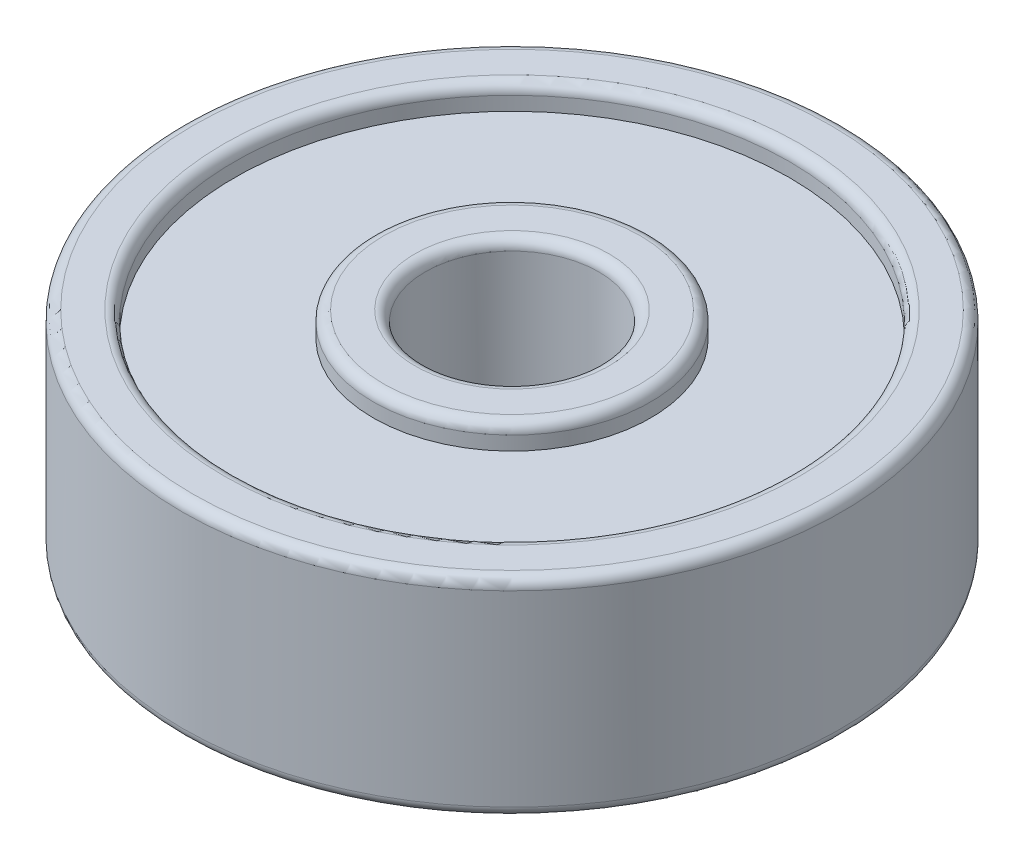
ISO-10303-21;
HEADER;
FILE_DESCRIPTION(('STEP AP214'),'2;1');
FILE_NAME('part.step','',(''),(''),'','','');
FILE_SCHEMA(('AUTOMOTIVE_DESIGN { 1 0 10303 214 1 1 1 1 }'));
ENDSEC;
DATA;
#1=APPLICATION_CONTEXT('core data for automotive mechanical design processes');
#2=APPLICATION_PROTOCOL_DEFINITION('international standard','automotive_design',2000,#1);
#3=PRODUCT_CONTEXT('',#1,'mechanical');
#4=PRODUCT('Part','Part','',(#3));
#5=PRODUCT_RELATED_PRODUCT_CATEGORY('part','',(#4));
#6=PRODUCT_DEFINITION_FORMATION('','',#4);
#7=PRODUCT_DEFINITION_CONTEXT('part definition',#1,'design');
#8=PRODUCT_DEFINITION('design','',#6,#7);
#9=PRODUCT_DEFINITION_SHAPE('','',#8);
#10=(LENGTH_UNIT() NAMED_UNIT(*) SI_UNIT(.MILLI.,.METRE.));
#11=(NAMED_UNIT(*) PLANE_ANGLE_UNIT() SI_UNIT($,.RADIAN.));
#12=(NAMED_UNIT(*) SI_UNIT($,.STERADIAN.) SOLID_ANGLE_UNIT());
#13=UNCERTAINTY_MEASURE_WITH_UNIT(LENGTH_MEASURE(1.E-05),#10,'distance_accuracy_value','');
#14=(GEOMETRIC_REPRESENTATION_CONTEXT(3) GLOBAL_UNCERTAINTY_ASSIGNED_CONTEXT((#13)) GLOBAL_UNIT_ASSIGNED_CONTEXT((#10,
#11,#12)) REPRESENTATION_CONTEXT('',''));
#15=CARTESIAN_POINT('',(0.,0.,0.));
#16=DIRECTION('',(0.,0.,1.));
#17=DIRECTION('',(1.,0.,0.));
#18=AXIS2_PLACEMENT_3D('',#15,#16,#17);
#19=CARTESIAN_POINT('',(4.,6.,0.));
#20=DIRECTION('',(0.,-1.,0.));
#21=DIRECTION('',(0.,0.,-1.));
#22=AXIS2_PLACEMENT_3D('',#19,#20,#21);
#23=PLANE('',#22);
#24=CARTESIAN_POINT('',(0.,6.,0.));
#25=DIRECTION('',(0.,-1.,0.));
#26=DIRECTION('',(0.,0.,-1.));
#27=AXIS2_PLACEMENT_3D('',#24,#25,#26);
#28=CIRCLE('',#27,3.7);
#29=CARTESIAN_POINT('',(0.,6.,-3.7));
#30=VERTEX_POINT('',#29);
#31=EDGE_CURVE('E56',#30,#30,#28,.F.);
#32=ORIENTED_EDGE('',*,*,#31,.T.);
#33=EDGE_LOOP('',(#32));
#34=FACE_BOUND('',#33,.T.);
#35=CARTESIAN_POINT('',(0.,6.,0.));
#36=DIRECTION('',(0.,-1.,0.));
#37=DIRECTION('',(0.,0.,-1.));
#38=AXIS2_PLACEMENT_3D('',#35,#36,#37);
#39=CIRCLE('',#38,2.8);
#40=CARTESIAN_POINT('',(0.,6.,-2.8));
#41=VERTEX_POINT('',#40);
#42=EDGE_CURVE('E59',#41,#41,#39,.T.);
#43=ORIENTED_EDGE('',*,*,#42,.T.);
#44=EDGE_LOOP('',(#43));
#45=FACE_BOUND('',#44,.T.);
#46=ADVANCED_FACE('F36',(#34,#45),#23,.F.);
#47=CARTESIAN_POINT('',(0.,4.61129603751149,0.));
#48=DIRECTION('',(0.,1.,0.));
#49=DIRECTION('',(0.,0.,1.));
#50=AXIS2_PLACEMENT_3D('',#47,#48,#49);
#51=CYLINDRICAL_SURFACE('',#50,2.5);
#52=CARTESIAN_POINT('',(0.,0.3,0.));
#53=DIRECTION('',(0.,1.,0.));
#54=DIRECTION('',(0.,0.,1.));
#55=AXIS2_PLACEMENT_3D('',#52,#53,#54);
#56=CIRCLE('',#55,2.5);
#57=CARTESIAN_POINT('',(0.,0.3,2.5));
#58=VERTEX_POINT('',#57);
#59=EDGE_CURVE('E80',#58,#58,#56,.F.);
#60=ORIENTED_EDGE('',*,*,#59,.T.);
#61=EDGE_LOOP('',(#60));
#62=FACE_BOUND('',#61,.T.);
#63=CARTESIAN_POINT('',(0.,5.7,0.));
#64=DIRECTION('',(0.,-1.,0.));
#65=DIRECTION('',(0.,0.,-1.));
#66=AXIS2_PLACEMENT_3D('',#63,#64,#65);
#67=CIRCLE('',#66,2.5);
#68=CARTESIAN_POINT('',(0.,5.7,-2.5));
#69=VERTEX_POINT('',#68);
#70=EDGE_CURVE('E83',#69,#69,#67,.F.);
#71=ORIENTED_EDGE('',*,*,#70,.T.);
#72=EDGE_LOOP('',(#71));
#73=FACE_BOUND('',#72,.T.);
#74=ADVANCED_FACE('F123',(#62,#73),#51,.F.);
#75=CARTESIAN_POINT('',(2.5,0.,0.));
#76=DIRECTION('',(0.,1.,0.));
#77=DIRECTION('',(0.,0.,1.));
#78=AXIS2_PLACEMENT_3D('',#75,#76,#77);
#79=PLANE('',#78);
#80=CARTESIAN_POINT('',(0.,0.,0.));
#81=DIRECTION('',(0.,1.,0.));
#82=DIRECTION('',(0.,0.,1.));
#83=AXIS2_PLACEMENT_3D('',#80,#81,#82);
#84=CIRCLE('',#83,2.8);
#85=CARTESIAN_POINT('',(0.,0.,2.8));
#86=VERTEX_POINT('',#85);
#87=EDGE_CURVE('E86',#86,#86,#84,.T.);
#88=ORIENTED_EDGE('',*,*,#87,.T.);
#89=EDGE_LOOP('',(#88));
#90=FACE_BOUND('',#89,.T.);
#91=CARTESIAN_POINT('',(0.,0.,0.));
#92=DIRECTION('',(0.,1.,0.));
#93=DIRECTION('',(0.,0.,1.));
#94=AXIS2_PLACEMENT_3D('',#91,#92,#93);
#95=CIRCLE('',#94,3.7);
#96=CARTESIAN_POINT('',(0.,0.,3.7));
#97=VERTEX_POINT('',#96);
#98=EDGE_CURVE('E89',#97,#97,#95,.F.);
#99=ORIENTED_EDGE('',*,*,#98,.T.);
#100=EDGE_LOOP('',(#99));
#101=FACE_BOUND('',#100,.T.);
#102=ADVANCED_FACE('F129',(#90,#101),#79,.F.);
#103=CARTESIAN_POINT('',(0.,4.61129603751149,0.));
#104=DIRECTION('',(0.,1.,0.));
#105=DIRECTION('',(0.,0.,1.));
#106=AXIS2_PLACEMENT_3D('',#103,#104,#105);
#107=CYLINDRICAL_SURFACE('',#106,4.);
#108=CARTESIAN_POINT('',(0.,0.3,0.));
#109=DIRECTION('',(0.,1.,0.));
#110=DIRECTION('',(0.,0.,1.));
#111=AXIS2_PLACEMENT_3D('',#108,#109,#110);
#112=CIRCLE('',#111,4.);
#113=CARTESIAN_POINT('',(0.,0.3,4.));
#114=VERTEX_POINT('',#113);
#115=EDGE_CURVE('E77',#114,#114,#112,.T.);
#116=ORIENTED_EDGE('',*,*,#115,.T.);
#117=EDGE_LOOP('',(#116));
#118=FACE_BOUND('',#117,.T.);
#119=CARTESIAN_POINT('',(0.,0.7,0.));
#120=DIRECTION('',(0.,1.,0.));
#121=DIRECTION('',(0.,0.,1.));
#122=AXIS2_PLACEMENT_3D('',#119,#120,#121);
#123=CIRCLE('',#122,4.);
#124=CARTESIAN_POINT('',(0.,0.7,4.));
#125=VERTEX_POINT('',#124);
#126=EDGE_CURVE('E92',#125,#125,#123,.T.);
#127=ORIENTED_EDGE('',*,*,#126,.F.);
#128=EDGE_LOOP('',(#127));
#129=FACE_BOUND('',#128,.T.);
#130=ADVANCED_FACE('F185',(#118,#129),#107,.T.);
#131=CARTESIAN_POINT('',(4.,0.7,0.));
#132=DIRECTION('',(0.,1.,0.));
#133=DIRECTION('',(0.,0.,1.));
#134=AXIS2_PLACEMENT_3D('',#131,#132,#133);
#135=PLANE('',#134);
#136=CARTESIAN_POINT('',(0.,0.7,0.));
#137=DIRECTION('',(0.,1.,0.));
#138=DIRECTION('',(0.,0.,1.));
#139=AXIS2_PLACEMENT_3D('',#136,#137,#138);
#140=CIRCLE('',#139,8.);
#141=CARTESIAN_POINT('',(0.,0.7,8.));
#142=VERTEX_POINT('',#141);
#143=EDGE_CURVE('E95',#142,#142,#140,.T.);
#144=ORIENTED_EDGE('',*,*,#143,.F.);
#145=EDGE_LOOP('',(#144));
#146=FACE_BOUND('',#145,.T.);
#147=ORIENTED_EDGE('',*,*,#126,.T.);
#148=EDGE_LOOP('',(#147));
#149=FACE_BOUND('',#148,.T.);
#150=ADVANCED_FACE('F181',(#146,#149),#135,.F.);
#151=CARTESIAN_POINT('',(0.,4.61129603751149,0.));
#152=DIRECTION('',(0.,1.,0.));
#153=DIRECTION('',(0.,0.,1.));
#154=AXIS2_PLACEMENT_3D('',#151,#152,#153);
#155=CYLINDRICAL_SURFACE('',#154,8.);
#156=CARTESIAN_POINT('',(0.,0.3,0.));
#157=DIRECTION('',(0.,1.,0.));
#158=DIRECTION('',(0.,0.,1.));
#159=AXIS2_PLACEMENT_3D('',#156,#157,#158);
#160=CIRCLE('',#159,8.);
#161=CARTESIAN_POINT('',(0.,0.3,8.));
#162=VERTEX_POINT('',#161);
#163=EDGE_CURVE('E68',#162,#162,#160,.F.);
#164=ORIENTED_EDGE('',*,*,#163,.T.);
#165=EDGE_LOOP('',(#164));
#166=FACE_BOUND('',#165,.T.);
#167=ORIENTED_EDGE('',*,*,#143,.T.);
#168=EDGE_LOOP('',(#167));
#169=FACE_BOUND('',#168,.T.);
#170=ADVANCED_FACE('F175',(#166,#169),#155,.F.);
#171=CARTESIAN_POINT('',(8.,0.,0.));
#172=DIRECTION('',(0.,1.,0.));
#173=DIRECTION('',(0.,0.,1.));
#174=AXIS2_PLACEMENT_3D('',#171,#172,#173);
#175=PLANE('',#174);
#176=CARTESIAN_POINT('',(0.,0.,0.));
#177=DIRECTION('',(0.,1.,0.));
#178=DIRECTION('',(0.,0.,1.));
#179=AXIS2_PLACEMENT_3D('',#176,#177,#178);
#180=CIRCLE('',#179,8.3);
#181=CARTESIAN_POINT('',(0.,0.,8.3));
#182=VERTEX_POINT('',#181);
#183=EDGE_CURVE('E71',#182,#182,#180,.T.);
#184=ORIENTED_EDGE('',*,*,#183,.T.);
#185=EDGE_LOOP('',(#184));
#186=FACE_BOUND('',#185,.T.);
#187=CARTESIAN_POINT('',(0.,0.,0.));
#188=DIRECTION('',(0.,1.,0.));
#189=DIRECTION('',(0.,0.,1.));
#190=AXIS2_PLACEMENT_3D('',#187,#188,#189);
#191=CIRCLE('',#190,9.2);
#192=CARTESIAN_POINT('',(0.,0.,9.2));
#193=VERTEX_POINT('',#192);
#194=EDGE_CURVE('E74',#193,#193,#191,.F.);
#195=ORIENTED_EDGE('',*,*,#194,.T.);
#196=EDGE_LOOP('',(#195));
#197=FACE_BOUND('',#196,.T.);
#198=ADVANCED_FACE('F169',(#186,#197),#175,.F.);
#199=CARTESIAN_POINT('',(0.,4.61129603751149,0.));
#200=DIRECTION('',(0.,1.,0.));
#201=DIRECTION('',(0.,0.,1.));
#202=AXIS2_PLACEMENT_3D('',#199,#200,#201);
#203=CYLINDRICAL_SURFACE('',#202,9.5);
#204=CARTESIAN_POINT('',(0.,0.3,0.));
#205=DIRECTION('',(0.,1.,0.));
#206=DIRECTION('',(0.,0.,1.));
#207=AXIS2_PLACEMENT_3D('',#204,#205,#206);
#208=CIRCLE('',#207,9.5);
#209=CARTESIAN_POINT('',(0.,0.3,9.5));
#210=VERTEX_POINT('',#209);
#211=EDGE_CURVE('E62',#210,#210,#208,.T.);
#212=ORIENTED_EDGE('',*,*,#211,.T.);
#213=EDGE_LOOP('',(#212));
#214=FACE_BOUND('',#213,.T.);
#215=CARTESIAN_POINT('',(0.,5.7,0.));
#216=DIRECTION('',(0.,-1.,0.));
#217=DIRECTION('',(0.,0.,-1.));
#218=AXIS2_PLACEMENT_3D('',#215,#216,#217);
#219=CIRCLE('',#218,9.5);
#220=CARTESIAN_POINT('',(0.,5.7,-9.5));
#221=VERTEX_POINT('',#220);
#222=EDGE_CURVE('E65',#221,#221,#219,.T.);
#223=ORIENTED_EDGE('',*,*,#222,.T.);
#224=EDGE_LOOP('',(#223));
#225=FACE_BOUND('',#224,.T.);
#226=ADVANCED_FACE('F120',(#214,#225),#203,.T.);
#227=CARTESIAN_POINT('',(9.5,6.,0.));
#228=DIRECTION('',(0.,-1.,0.));
#229=DIRECTION('',(0.,0.,-1.));
#230=AXIS2_PLACEMENT_3D('',#227,#228,#229);
#231=PLANE('',#230);
#232=CARTESIAN_POINT('',(0.,6.,0.));
#233=DIRECTION('',(0.,-1.,0.));
#234=DIRECTION('',(0.,0.,-1.));
#235=AXIS2_PLACEMENT_3D('',#232,#233,#234);
#236=CIRCLE('',#235,9.2);
#237=CARTESIAN_POINT('',(0.,6.,-9.2));
#238=VERTEX_POINT('',#237);
#239=EDGE_CURVE('E43',#238,#238,#236,.F.);
#240=ORIENTED_EDGE('',*,*,#239,.T.);
#241=EDGE_LOOP('',(#240));
#242=FACE_BOUND('',#241,.T.);
#243=CARTESIAN_POINT('',(0.,6.,0.));
#244=DIRECTION('',(0.,-1.,0.));
#245=DIRECTION('',(0.,0.,-1.));
#246=AXIS2_PLACEMENT_3D('',#243,#244,#245);
#247=CIRCLE('',#246,8.3);
#248=CARTESIAN_POINT('',(0.,6.,-8.3));
#249=VERTEX_POINT('',#248);
#250=EDGE_CURVE('E47',#249,#249,#247,.T.);
#251=ORIENTED_EDGE('',*,*,#250,.T.);
#252=EDGE_LOOP('',(#251));
#253=FACE_BOUND('',#252,.T.);
#254=ADVANCED_FACE('F115',(#242,#253),#231,.F.);
#255=CARTESIAN_POINT('',(0.,4.61129603751149,0.));
#256=DIRECTION('',(0.,1.,0.));
#257=DIRECTION('',(0.,0.,1.));
#258=AXIS2_PLACEMENT_3D('',#255,#256,#257);
#259=CYLINDRICAL_SURFACE('',#258,8.);
#260=CARTESIAN_POINT('',(0.,5.7,0.));
#261=DIRECTION('',(0.,-1.,0.));
#262=DIRECTION('',(0.,0.,-1.));
#263=AXIS2_PLACEMENT_3D('',#260,#261,#262);
#264=CIRCLE('',#263,8.);
#265=CARTESIAN_POINT('',(0.,5.7,-8.));
#266=VERTEX_POINT('',#265);
#267=EDGE_CURVE('E10',#266,#266,#264,.F.);
#268=ORIENTED_EDGE('',*,*,#267,.T.);
#269=EDGE_LOOP('',(#268));
#270=FACE_BOUND('',#269,.T.);
#271=CARTESIAN_POINT('',(0.,5.3,0.));
#272=DIRECTION('',(0.,1.,0.));
#273=DIRECTION('',(0.,0.,1.));
#274=AXIS2_PLACEMENT_3D('',#271,#272,#273);
#275=CIRCLE('',#274,8.);
#276=CARTESIAN_POINT('',(0.,5.3,8.));
#277=VERTEX_POINT('',#276);
#278=EDGE_CURVE('E98',#277,#277,#275,.T.);
#279=ORIENTED_EDGE('',*,*,#278,.F.);
#280=EDGE_LOOP('',(#279));
#281=FACE_BOUND('',#280,.T.);
#282=ADVANCED_FACE('F110',(#270,#281),#259,.F.);
#283=CARTESIAN_POINT('',(8.,5.3,0.));
#284=DIRECTION('',(0.,-1.,0.));
#285=DIRECTION('',(0.,0.,-1.));
#286=AXIS2_PLACEMENT_3D('',#283,#284,#285);
#287=PLANE('',#286);
#288=CARTESIAN_POINT('',(0.,5.3,0.));
#289=DIRECTION('',(0.,1.,0.));
#290=DIRECTION('',(0.,0.,1.));
#291=AXIS2_PLACEMENT_3D('',#288,#289,#290);
#292=CIRCLE('',#291,4.);
#293=CARTESIAN_POINT('',(0.,5.3,4.));
#294=VERTEX_POINT('',#293);
#295=EDGE_CURVE('E101',#294,#294,#292,.T.);
#296=ORIENTED_EDGE('',*,*,#295,.F.);
#297=EDGE_LOOP('',(#296));
#298=FACE_BOUND('',#297,.T.);
#299=ORIENTED_EDGE('',*,*,#278,.T.);
#300=EDGE_LOOP('',(#299));
#301=FACE_BOUND('',#300,.T.);
#302=ADVANCED_FACE('F107',(#298,#301),#287,.F.);
#303=CARTESIAN_POINT('',(0.,4.61129603751149,0.));
#304=DIRECTION('',(0.,1.,0.));
#305=DIRECTION('',(0.,0.,1.));
#306=AXIS2_PLACEMENT_3D('',#303,#304,#305);
#307=CYLINDRICAL_SURFACE('',#306,4.);
#308=CARTESIAN_POINT('',(0.,5.7,0.));
#309=DIRECTION('',(0.,-1.,0.));
#310=DIRECTION('',(0.,0.,-1.));
#311=AXIS2_PLACEMENT_3D('',#308,#309,#310);
#312=CIRCLE('',#311,4.);
#313=CARTESIAN_POINT('',(0.,5.7,-4.));
#314=VERTEX_POINT('',#313);
#315=EDGE_CURVE('E51',#314,#314,#312,.T.);
#316=ORIENTED_EDGE('',*,*,#315,.T.);
#317=EDGE_LOOP('',(#316));
#318=FACE_BOUND('',#317,.T.);
#319=ORIENTED_EDGE('',*,*,#295,.T.);
#320=EDGE_LOOP('',(#319));
#321=FACE_BOUND('',#320,.T.);
#322=ADVANCED_FACE('F105',(#318,#321),#307,.T.);
#323=CARTESIAN_POINT('',(0.,0.3,0.));
#324=DIRECTION('',(0.,1.,0.));
#325=DIRECTION('',(0.,0.,1.));
#326=AXIS2_PLACEMENT_3D('',#323,#324,#325);
#327=TOROIDAL_SURFACE('',#326,2.8,0.3);
#328=ORIENTED_EDGE('',*,*,#59,.F.);
#329=EDGE_LOOP('',(#328));
#330=FACE_BOUND('',#329,.T.);
#331=ORIENTED_EDGE('',*,*,#87,.F.);
#332=EDGE_LOOP('',(#331));
#333=FACE_BOUND('',#332,.T.);
#334=ADVANCED_FACE('F135',(#330,#333),#327,.T.);
#335=CARTESIAN_POINT('',(0.,0.3,0.));
#336=DIRECTION('',(0.,1.,0.));
#337=DIRECTION('',(0.,0.,1.));
#338=AXIS2_PLACEMENT_3D('',#335,#336,#337);
#339=TOROIDAL_SURFACE('',#338,3.7,0.3);
#340=ORIENTED_EDGE('',*,*,#98,.F.);
#341=EDGE_LOOP('',(#340));
#342=FACE_BOUND('',#341,.T.);
#343=ORIENTED_EDGE('',*,*,#115,.F.);
#344=EDGE_LOOP('',(#343));
#345=FACE_BOUND('',#344,.T.);
#346=ADVANCED_FACE('F138',(#342,#345),#339,.T.);
#347=CARTESIAN_POINT('',(0.,0.3,0.));
#348=DIRECTION('',(0.,1.,0.));
#349=DIRECTION('',(0.,0.,1.));
#350=AXIS2_PLACEMENT_3D('',#347,#348,#349);
#351=TOROIDAL_SURFACE('',#350,8.3,0.3);
#352=ORIENTED_EDGE('',*,*,#163,.F.);
#353=EDGE_LOOP('',(#352));
#354=FACE_BOUND('',#353,.T.);
#355=ORIENTED_EDGE('',*,*,#183,.F.);
#356=EDGE_LOOP('',(#355));
#357=FACE_BOUND('',#356,.T.);
#358=ADVANCED_FACE('F142',(#354,#357),#351,.T.);
#359=CARTESIAN_POINT('',(0.,0.3,0.));
#360=DIRECTION('',(0.,1.,0.));
#361=DIRECTION('',(0.,0.,1.));
#362=AXIS2_PLACEMENT_3D('',#359,#360,#361);
#363=TOROIDAL_SURFACE('',#362,9.2,0.3);
#364=ORIENTED_EDGE('',*,*,#194,.F.);
#365=EDGE_LOOP('',(#364));
#366=FACE_BOUND('',#365,.T.);
#367=ORIENTED_EDGE('',*,*,#211,.F.);
#368=EDGE_LOOP('',(#367));
#369=FACE_BOUND('',#368,.T.);
#370=ADVANCED_FACE('F146',(#366,#369),#363,.T.);
#371=CARTESIAN_POINT('',(0.,5.7,0.));
#372=DIRECTION('',(0.,-1.,0.));
#373=DIRECTION('',(0.,0.,-1.));
#374=AXIS2_PLACEMENT_3D('',#371,#372,#373);
#375=TOROIDAL_SURFACE('',#374,3.7,0.3);
#376=ORIENTED_EDGE('',*,*,#315,.F.);
#377=EDGE_LOOP('',(#376));
#378=FACE_BOUND('',#377,.T.);
#379=ORIENTED_EDGE('',*,*,#31,.F.);
#380=EDGE_LOOP('',(#379));
#381=FACE_BOUND('',#380,.T.);
#382=ADVANCED_FACE('F150',(#378,#381),#375,.T.);
#383=CARTESIAN_POINT('',(0.,5.7,0.));
#384=DIRECTION('',(0.,-1.,0.));
#385=DIRECTION('',(0.,0.,-1.));
#386=AXIS2_PLACEMENT_3D('',#383,#384,#385);
#387=TOROIDAL_SURFACE('',#386,2.8,0.3);
#388=ORIENTED_EDGE('',*,*,#42,.F.);
#389=EDGE_LOOP('',(#388));
#390=FACE_BOUND('',#389,.T.);
#391=ORIENTED_EDGE('',*,*,#70,.F.);
#392=EDGE_LOOP('',(#391));
#393=FACE_BOUND('',#392,.T.);
#394=ADVANCED_FACE('F154',(#390,#393),#387,.T.);
#395=CARTESIAN_POINT('',(0.,5.7,0.));
#396=DIRECTION('',(0.,-1.,0.));
#397=DIRECTION('',(0.,0.,-1.));
#398=AXIS2_PLACEMENT_3D('',#395,#396,#397);
#399=TOROIDAL_SURFACE('',#398,9.2,0.3);
#400=ORIENTED_EDGE('',*,*,#222,.F.);
#401=EDGE_LOOP('',(#400));
#402=FACE_BOUND('',#401,.T.);
#403=ORIENTED_EDGE('',*,*,#239,.F.);
#404=EDGE_LOOP('',(#403));
#405=FACE_BOUND('',#404,.T.);
#406=ADVANCED_FACE('F157',(#402,#405),#399,.T.);
#407=CARTESIAN_POINT('',(0.,5.7,0.));
#408=DIRECTION('',(0.,-1.,0.));
#409=DIRECTION('',(0.,0.,-1.));
#410=AXIS2_PLACEMENT_3D('',#407,#408,#409);
#411=TOROIDAL_SURFACE('',#410,8.3,0.3);
#412=ORIENTED_EDGE('',*,*,#250,.F.);
#413=EDGE_LOOP('',(#412));
#414=FACE_BOUND('',#413,.T.);
#415=ORIENTED_EDGE('',*,*,#267,.F.);
#416=EDGE_LOOP('',(#415));
#417=FACE_BOUND('',#416,.T.);
#418=ADVANCED_FACE('F38',(#414,#417),#411,.T.);
#419=CLOSED_SHELL('',(#46,#74,#102,#130,#150,#170,#198,#226,#254,#282,#302,#322,#334,#346,#358,
#370,#382,#394,#406,#418));
#420=MANIFOLD_SOLID_BREP('B2',#419);
#421=ADVANCED_BREP_SHAPE_REPRESENTATION('',(#18,#420),#14);
#422=SHAPE_DEFINITION_REPRESENTATION(#9,#421);
ENDSEC;
END-ISO-10303-21;
